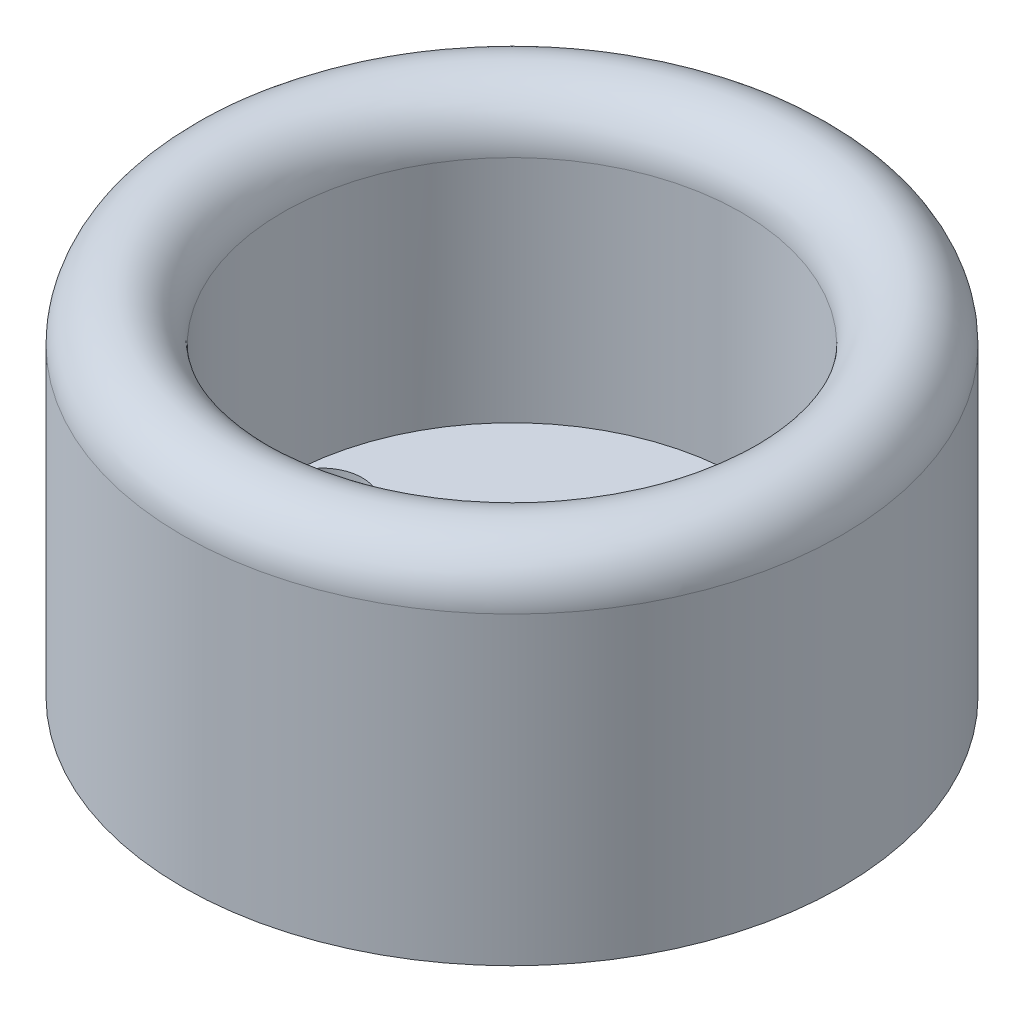
ISO-10303-21;
HEADER;
FILE_DESCRIPTION(('STEP AP214'),'2;1');
FILE_NAME('part.step','',(''),(''),'','','');
FILE_SCHEMA(('AUTOMOTIVE_DESIGN { 1 0 10303 214 1 1 1 1 }'));
ENDSEC;
DATA;
#1=APPLICATION_CONTEXT('core data for automotive mechanical design processes');
#2=APPLICATION_PROTOCOL_DEFINITION('international standard','automotive_design',2000,#1);
#3=PRODUCT_CONTEXT('',#1,'mechanical');
#4=PRODUCT('Part','Part','',(#3));
#5=PRODUCT_RELATED_PRODUCT_CATEGORY('part','',(#4));
#6=PRODUCT_DEFINITION_FORMATION('','',#4);
#7=PRODUCT_DEFINITION_CONTEXT('part definition',#1,'design');
#8=PRODUCT_DEFINITION('design','',#6,#7);
#9=PRODUCT_DEFINITION_SHAPE('','',#8);
#10=(LENGTH_UNIT() NAMED_UNIT(*) SI_UNIT(.MILLI.,.METRE.));
#11=(NAMED_UNIT(*) PLANE_ANGLE_UNIT() SI_UNIT($,.RADIAN.));
#12=(NAMED_UNIT(*) SI_UNIT($,.STERADIAN.) SOLID_ANGLE_UNIT());
#13=UNCERTAINTY_MEASURE_WITH_UNIT(LENGTH_MEASURE(1.E-05),#10,'distance_accuracy_value','');
#14=(GEOMETRIC_REPRESENTATION_CONTEXT(3) GLOBAL_UNCERTAINTY_ASSIGNED_CONTEXT((#13)) GLOBAL_UNIT_ASSIGNED_CONTEXT((#10,
#11,#12)) REPRESENTATION_CONTEXT('',''));
#15=CARTESIAN_POINT('',(0.,0.,0.));
#16=DIRECTION('',(0.,0.,1.));
#17=DIRECTION('',(1.,0.,0.));
#18=AXIS2_PLACEMENT_3D('',#15,#16,#17);
#19=CARTESIAN_POINT('',(0.,30.5,0.));
#20=DIRECTION('',(0.,-1.,0.));
#21=DIRECTION('',(0.,0.,-1.));
#22=AXIS2_PLACEMENT_3D('',#19,#20,#21);
#23=TOROIDAL_SURFACE('',#22,28.,5.);
#24=CARTESIAN_POINT('',(0.,30.5,0.));
#25=DIRECTION('',(0.,-1.,0.));
#26=DIRECTION('',(0.,0.,-1.));
#27=AXIS2_PLACEMENT_3D('',#24,#25,#26);
#28=CIRCLE('',#27,33.);
#29=CARTESIAN_POINT('',(0.,30.5,-33.));
#30=VERTEX_POINT('',#29);
#31=EDGE_CURVE('E56',#30,#30,#28,.T.);
#32=ORIENTED_EDGE('',*,*,#31,.F.);
#33=EDGE_LOOP('',(#32));
#34=FACE_BOUND('',#33,.T.);
#35=CARTESIAN_POINT('',(0.,30.5,0.));
#36=DIRECTION('',(0.,-1.,0.));
#37=DIRECTION('',(0.,0.,-1.));
#38=AXIS2_PLACEMENT_3D('',#35,#36,#37);
#39=CIRCLE('',#38,23.);
#40=CARTESIAN_POINT('',(0.,30.5,-23.));
#41=VERTEX_POINT('',#40);
#42=EDGE_CURVE('E11',#41,#41,#39,.F.);
#43=ORIENTED_EDGE('',*,*,#42,.F.);
#44=EDGE_LOOP('',(#43));
#45=FACE_BOUND('',#44,.T.);
#46=ADVANCED_FACE('F47',(#34,#45),#23,.T.);
#47=CARTESIAN_POINT('',(0.,7.5,0.));
#48=DIRECTION('',(0.,1.,0.));
#49=DIRECTION('',(0.,0.,1.));
#50=AXIS2_PLACEMENT_3D('',#47,#48,#49);
#51=PLANE('',#50);
#52=CARTESIAN_POINT('',(0.,7.5,0.));
#53=DIRECTION('',(0.,1.,0.));
#54=DIRECTION('',(0.,0.,1.));
#55=AXIS2_PLACEMENT_3D('',#52,#53,#54);
#56=CIRCLE('',#55,5.5);
#57=CARTESIAN_POINT('',(0.,7.5,5.5));
#58=VERTEX_POINT('',#57);
#59=EDGE_CURVE('E94',#58,#58,#56,.T.);
#60=ORIENTED_EDGE('',*,*,#59,.F.);
#61=EDGE_LOOP('',(#60));
#62=FACE_BOUND('',#61,.T.);
#63=CARTESIAN_POINT('',(19.,7.5,0.));
#64=DIRECTION('',(0.,1.,0.));
#65=DIRECTION('',(0.,0.,1.));
#66=AXIS2_PLACEMENT_3D('',#63,#64,#65);
#67=CIRCLE('',#66,4.);
#68=CARTESIAN_POINT('',(23.,7.5,0.));
#69=VERTEX_POINT('',#68);
#70=EDGE_CURVE('E76',#69,#69,#67,.T.);
#71=ORIENTED_EDGE('',*,*,#70,.F.);
#72=CARTESIAN_POINT('',(0.,7.5,0.));
#73=DIRECTION('',(0.,1.,0.));
#74=DIRECTION('',(0.,0.,1.));
#75=AXIS2_PLACEMENT_3D('',#72,#73,#74);
#76=CIRCLE('',#75,23.);
#77=CARTESIAN_POINT('',(-23.,7.5,0.));
#78=VERTEX_POINT('',#77);
#79=EDGE_CURVE('E62',#69,#78,#76,.T.);
#80=ORIENTED_EDGE('',*,*,#79,.T.);
#81=CARTESIAN_POINT('',(-19.,7.5,0.));
#82=DIRECTION('',(0.,1.,0.));
#83=DIRECTION('',(0.,0.,1.));
#84=AXIS2_PLACEMENT_3D('',#81,#82,#83);
#85=CIRCLE('',#84,4.);
#86=EDGE_CURVE('E75',#78,#78,#85,.T.);
#87=ORIENTED_EDGE('',*,*,#86,.F.);
#88=EDGE_CURVE('E64',#78,#69,#76,.T.);
#89=ORIENTED_EDGE('',*,*,#88,.T.);
#90=EDGE_LOOP('',(#71,#80,#87,#89));
#91=FACE_BOUND('',#90,.T.);
#92=ADVANCED_FACE('F74',(#62,#91),#51,.T.);
#93=CARTESIAN_POINT('',(-19.,7.5,0.));
#94=DIRECTION('',(0.,-1.,0.));
#95=DIRECTION('',(0.,0.,-1.));
#96=AXIS2_PLACEMENT_3D('',#93,#94,#95);
#97=CYLINDRICAL_SURFACE('',#96,1.8);
#98=CARTESIAN_POINT('',(-19.,0.,0.));
#99=DIRECTION('',(0.,1.,0.));
#100=DIRECTION('',(0.,0.,1.));
#101=AXIS2_PLACEMENT_3D('',#98,#99,#100);
#102=CIRCLE('',#101,1.8);
#103=CARTESIAN_POINT('',(-19.,0.,1.8));
#104=VERTEX_POINT('',#103);
#105=EDGE_CURVE('E107',#104,#104,#102,.T.);
#106=ORIENTED_EDGE('',*,*,#105,.F.);
#107=EDGE_LOOP('',(#106));
#108=FACE_BOUND('',#107,.T.);
#109=CARTESIAN_POINT('',(-19.,1.5,0.));
#110=DIRECTION('',(0.,1.,0.));
#111=DIRECTION('',(0.,0.,1.));
#112=AXIS2_PLACEMENT_3D('',#109,#110,#111);
#113=CIRCLE('',#112,1.8);
#114=CARTESIAN_POINT('',(-19.,1.5,1.8));
#115=VERTEX_POINT('',#114);
#116=EDGE_CURVE('E103',#115,#115,#113,.T.);
#117=ORIENTED_EDGE('',*,*,#116,.T.);
#118=EDGE_LOOP('',(#117));
#119=FACE_BOUND('',#118,.T.);
#120=ADVANCED_FACE('F157',(#108,#119),#97,.F.);
#121=CARTESIAN_POINT('',(19.,7.5,0.));
#122=DIRECTION('',(0.,-1.,0.));
#123=DIRECTION('',(0.,0.,-1.));
#124=AXIS2_PLACEMENT_3D('',#121,#122,#123);
#125=CYLINDRICAL_SURFACE('',#124,1.8);
#126=CARTESIAN_POINT('',(19.,0.,0.));
#127=DIRECTION('',(0.,1.,0.));
#128=DIRECTION('',(0.,0.,-1.));
#129=AXIS2_PLACEMENT_3D('',#126,#127,#128);
#130=CIRCLE('',#129,1.8);
#131=CARTESIAN_POINT('',(19.,0.,-1.80000000000001));
#132=VERTEX_POINT('',#131);
#133=EDGE_CURVE('E98',#132,#132,#130,.T.);
#134=ORIENTED_EDGE('',*,*,#133,.F.);
#135=EDGE_LOOP('',(#134));
#136=FACE_BOUND('',#135,.T.);
#137=CARTESIAN_POINT('',(19.,1.5,0.));
#138=DIRECTION('',(0.,1.,0.));
#139=DIRECTION('',(0.,0.,1.));
#140=AXIS2_PLACEMENT_3D('',#137,#138,#139);
#141=CIRCLE('',#140,1.8);
#142=CARTESIAN_POINT('',(19.,1.5,1.8));
#143=VERTEX_POINT('',#142);
#144=EDGE_CURVE('E87',#143,#143,#141,.T.);
#145=ORIENTED_EDGE('',*,*,#144,.T.);
#146=EDGE_LOOP('',(#145));
#147=FACE_BOUND('',#146,.T.);
#148=ADVANCED_FACE('F154',(#136,#147),#125,.F.);
#149=CARTESIAN_POINT('',(0.,0.,0.));
#150=DIRECTION('',(0.,1.,0.));
#151=DIRECTION('',(0.,0.,1.));
#152=AXIS2_PLACEMENT_3D('',#149,#150,#151);
#153=PLANE('',#152);
#154=CARTESIAN_POINT('',(0.,0.,0.));
#155=DIRECTION('',(0.,-1.,0.));
#156=DIRECTION('',(0.,0.,-1.));
#157=AXIS2_PLACEMENT_3D('',#154,#155,#156);
#158=CIRCLE('',#157,33.);
#159=CARTESIAN_POINT('',(0.,0.,-33.));
#160=VERTEX_POINT('',#159);
#161=EDGE_CURVE('E71',#160,#160,#158,.T.);
#162=ORIENTED_EDGE('',*,*,#161,.T.);
#163=EDGE_LOOP('',(#162));
#164=FACE_BOUND('',#163,.T.);
#165=CARTESIAN_POINT('',(0.,0.,0.));
#166=DIRECTION('',(0.,1.,0.));
#167=DIRECTION('',(0.,0.,1.));
#168=AXIS2_PLACEMENT_3D('',#165,#166,#167);
#169=CIRCLE('',#168,5.5);
#170=CARTESIAN_POINT('',(0.,0.,5.5));
#171=VERTEX_POINT('',#170);
#172=EDGE_CURVE('E99',#171,#171,#169,.T.);
#173=ORIENTED_EDGE('',*,*,#172,.T.);
#174=EDGE_LOOP('',(#173));
#175=FACE_BOUND('',#174,.T.);
#176=ORIENTED_EDGE('',*,*,#133,.T.);
#177=EDGE_LOOP('',(#176));
#178=FACE_BOUND('',#177,.T.);
#179=ORIENTED_EDGE('',*,*,#105,.T.);
#180=EDGE_LOOP('',(#179));
#181=FACE_BOUND('',#180,.T.);
#182=ADVANCED_FACE('F152',(#164,#175,#178,#181),#153,.F.);
#183=CARTESIAN_POINT('',(0.,7.5,0.));
#184=DIRECTION('',(0.,-1.,0.));
#185=DIRECTION('',(0.,0.,-1.));
#186=AXIS2_PLACEMENT_3D('',#183,#184,#185);
#187=CYLINDRICAL_SURFACE('',#186,5.5);
#188=ORIENTED_EDGE('',*,*,#59,.T.);
#189=EDGE_LOOP('',(#188));
#190=FACE_BOUND('',#189,.T.);
#191=ORIENTED_EDGE('',*,*,#172,.F.);
#192=EDGE_LOOP('',(#191));
#193=FACE_BOUND('',#192,.T.);
#194=ADVANCED_FACE('F145',(#190,#193),#187,.F.);
#195=CARTESIAN_POINT('',(19.,1.5,0.));
#196=DIRECTION('',(0.,1.,0.));
#197=DIRECTION('',(0.,0.,1.));
#198=AXIS2_PLACEMENT_3D('',#195,#196,#197);
#199=CYLINDRICAL_SURFACE('',#198,4.);
#200=CARTESIAN_POINT('',(19.,1.5,0.));
#201=DIRECTION('',(0.,1.,0.));
#202=DIRECTION('',(0.,0.,1.));
#203=AXIS2_PLACEMENT_3D('',#200,#201,#202);
#204=CIRCLE('',#203,4.);
#205=CARTESIAN_POINT('',(19.,1.5,3.99999999999999));
#206=VERTEX_POINT('',#205);
#207=EDGE_CURVE('E78',#206,#206,#204,.T.);
#208=ORIENTED_EDGE('',*,*,#207,.F.);
#209=EDGE_LOOP('',(#208));
#210=FACE_BOUND('',#209,.T.);
#211=ORIENTED_EDGE('',*,*,#70,.T.);
#212=EDGE_LOOP('',(#211));
#213=FACE_BOUND('',#212,.T.);
#214=ADVANCED_FACE('F142',(#210,#213),#199,.F.);
#215=CARTESIAN_POINT('',(19.,1.5,0.));
#216=DIRECTION('',(0.,1.,0.));
#217=DIRECTION('',(0.,0.,1.));
#218=AXIS2_PLACEMENT_3D('',#215,#216,#217);
#219=PLANE('',#218);
#220=ORIENTED_EDGE('',*,*,#144,.F.);
#221=EDGE_LOOP('',(#220));
#222=FACE_BOUND('',#221,.T.);
#223=ORIENTED_EDGE('',*,*,#207,.T.);
#224=EDGE_LOOP('',(#223));
#225=FACE_BOUND('',#224,.T.);
#226=ADVANCED_FACE('F140',(#222,#225),#219,.T.);
#227=CARTESIAN_POINT('',(-19.,1.5,0.));
#228=DIRECTION('',(0.,1.,0.));
#229=DIRECTION('',(0.,0.,1.));
#230=AXIS2_PLACEMENT_3D('',#227,#228,#229);
#231=CYLINDRICAL_SURFACE('',#230,4.);
#232=CARTESIAN_POINT('',(-19.,1.5,0.));
#233=DIRECTION('',(0.,1.,0.));
#234=DIRECTION('',(0.,0.,1.));
#235=AXIS2_PLACEMENT_3D('',#232,#233,#234);
#236=CIRCLE('',#235,4.);
#237=CARTESIAN_POINT('',(-19.,1.5,4.));
#238=VERTEX_POINT('',#237);
#239=EDGE_CURVE('E82',#238,#238,#236,.T.);
#240=ORIENTED_EDGE('',*,*,#239,.F.);
#241=EDGE_LOOP('',(#240));
#242=FACE_BOUND('',#241,.T.);
#243=ORIENTED_EDGE('',*,*,#86,.T.);
#244=EDGE_LOOP('',(#243));
#245=FACE_BOUND('',#244,.T.);
#246=ADVANCED_FACE('F80',(#242,#245),#231,.F.);
#247=CARTESIAN_POINT('',(-19.,1.5,0.));
#248=DIRECTION('',(0.,1.,0.));
#249=DIRECTION('',(0.,0.,1.));
#250=AXIS2_PLACEMENT_3D('',#247,#248,#249);
#251=PLANE('',#250);
#252=ORIENTED_EDGE('',*,*,#116,.F.);
#253=EDGE_LOOP('',(#252));
#254=FACE_BOUND('',#253,.T.);
#255=ORIENTED_EDGE('',*,*,#239,.T.);
#256=EDGE_LOOP('',(#255));
#257=FACE_BOUND('',#256,.T.);
#258=ADVANCED_FACE('F132',(#254,#257),#251,.T.);
#259=CARTESIAN_POINT('',(0.,35.5,0.));
#260=DIRECTION('',(0.,-1.,0.));
#261=DIRECTION('',(0.,0.,-1.));
#262=AXIS2_PLACEMENT_3D('',#259,#260,#261);
#263=CYLINDRICAL_SURFACE('',#262,33.);
#264=ORIENTED_EDGE('',*,*,#31,.T.);
#265=EDGE_LOOP('',(#264));
#266=FACE_BOUND('',#265,.T.);
#267=ORIENTED_EDGE('',*,*,#161,.F.);
#268=EDGE_LOOP('',(#267));
#269=FACE_BOUND('',#268,.T.);
#270=ADVANCED_FACE('F120',(#266,#269),#263,.T.);
#271=CARTESIAN_POINT('',(0.,35.5,0.));
#272=DIRECTION('',(0.,-1.,0.));
#273=DIRECTION('',(0.,0.,-1.));
#274=AXIS2_PLACEMENT_3D('',#271,#272,#273);
#275=CYLINDRICAL_SURFACE('',#274,23.);
#276=ORIENTED_EDGE('',*,*,#42,.T.);
#277=EDGE_LOOP('',(#276));
#278=FACE_BOUND('',#277,.T.);
#279=ORIENTED_EDGE('',*,*,#79,.F.);
#280=ORIENTED_EDGE('',*,*,#88,.F.);
#281=EDGE_LOOP('',(#279,#280));
#282=FACE_BOUND('',#281,.T.);
#283=ADVANCED_FACE('F65',(#278,#282),#275,.F.);
#284=CLOSED_SHELL('',(#46,#92,#120,#148,#182,#194,#214,#226,#246,#258,#270,#283));
#285=MANIFOLD_SOLID_BREP('B2',#284);
#286=ADVANCED_BREP_SHAPE_REPRESENTATION('',(#18,#285),#14);
#287=SHAPE_DEFINITION_REPRESENTATION(#9,#286);
ENDSEC;
END-ISO-10303-21;
